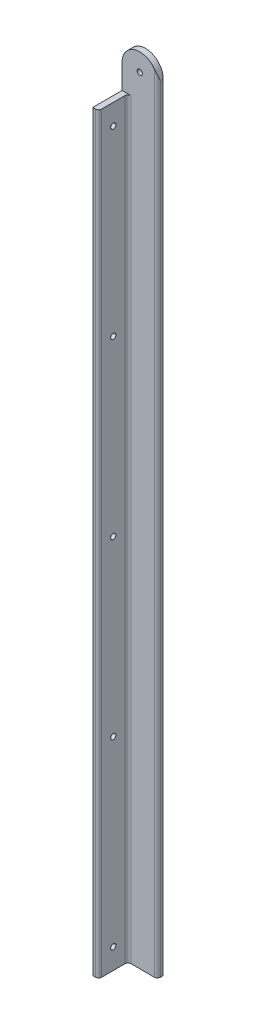
ISO-10303-21;
HEADER;
FILE_DESCRIPTION(('STEP AP214'),'2;1');
FILE_NAME('part.step','',(''),(''),'','','');
FILE_SCHEMA(('AUTOMOTIVE_DESIGN { 1 0 10303 214 1 1 1 1 }'));
ENDSEC;
DATA;
#1=APPLICATION_CONTEXT('core data for automotive mechanical design processes');
#2=APPLICATION_PROTOCOL_DEFINITION('international standard','automotive_design',2000,#1);
#3=PRODUCT_CONTEXT('',#1,'mechanical');
#4=PRODUCT('Part','Part','',(#3));
#5=PRODUCT_RELATED_PRODUCT_CATEGORY('part','',(#4));
#6=PRODUCT_DEFINITION_FORMATION('','',#4);
#7=PRODUCT_DEFINITION_CONTEXT('part definition',#1,'design');
#8=PRODUCT_DEFINITION('design','',#6,#7);
#9=PRODUCT_DEFINITION_SHAPE('','',#8);
#10=(LENGTH_UNIT() NAMED_UNIT(*) SI_UNIT(.MILLI.,.METRE.));
#11=(NAMED_UNIT(*) PLANE_ANGLE_UNIT() SI_UNIT($,.RADIAN.));
#12=(NAMED_UNIT(*) SI_UNIT($,.STERADIAN.) SOLID_ANGLE_UNIT());
#13=UNCERTAINTY_MEASURE_WITH_UNIT(LENGTH_MEASURE(1.E-05),#10,'distance_accuracy_value','');
#14=(GEOMETRIC_REPRESENTATION_CONTEXT(3) GLOBAL_UNCERTAINTY_ASSIGNED_CONTEXT((#13)) GLOBAL_UNIT_ASSIGNED_CONTEXT((#10,
#11,#12)) REPRESENTATION_CONTEXT('',''));
#15=CARTESIAN_POINT('',(0.,0.,0.));
#16=DIRECTION('',(0.,0.,1.));
#17=DIRECTION('',(1.,0.,0.));
#18=AXIS2_PLACEMENT_3D('',#15,#16,#17);
#19=CARTESIAN_POINT('',(0.,431.8,5.08));
#20=DIRECTION('',(0.,0.,1.));
#21=DIRECTION('',(-1.,0.,0.));
#22=AXIS2_PLACEMENT_3D('',#19,#20,#21);
#23=PLANE('',#22);
#24=CARTESIAN_POINT('',(9.525,419.735,5.08));
#25=DIRECTION('',(0.,0.,-1.));
#26=DIRECTION('',(-1.,0.,0.));
#27=AXIS2_PLACEMENT_3D('',#24,#25,#26);
#28=CIRCLE('',#27,1.42239999999997);
#29=CARTESIAN_POINT('',(8.10260000000003,419.735,5.08));
#30=VERTEX_POINT('',#29);
#31=EDGE_CURVE('E235',#30,#30,#28,.T.);
#32=ORIENTED_EDGE('',*,*,#31,.F.);
#33=EDGE_LOOP('',(#32));
#34=FACE_BOUND('',#33,.T.);
#35=DIRECTION('',(0.,-1.,0.));
#36=VECTOR('',#35,1.);
#37=CARTESIAN_POINT('',(0.,431.8,5.08));
#38=LINE('',#37,#36);
#39=CARTESIAN_POINT('',(0.,419.735,5.08));
#40=VERTEX_POINT('',#39);
#41=CARTESIAN_POINT('',(0.,0.,5.08));
#42=VERTEX_POINT('',#41);
#43=EDGE_CURVE('E11',#40,#42,#38,.T.);
#44=ORIENTED_EDGE('',*,*,#43,.F.);
#45=CARTESIAN_POINT('',(9.525,419.735,5.08));
#46=DIRECTION('',(0.,0.,1.));
#47=DIRECTION('',(1.,0.,0.));
#48=AXIS2_PLACEMENT_3D('',#45,#46,#47);
#49=CIRCLE('',#48,9.525);
#50=CARTESIAN_POINT('',(19.05,419.735,5.08));
#51=VERTEX_POINT('',#50);
#52=EDGE_CURVE('E125',#51,#40,#49,.T.);
#53=ORIENTED_EDGE('',*,*,#52,.F.);
#54=DIRECTION('',(0.,-1.,0.));
#55=VECTOR('',#54,1.);
#56=CARTESIAN_POINT('',(19.05,431.8,5.08));
#57=LINE('',#56,#55);
#58=CARTESIAN_POINT('',(19.05,0.,5.08));
#59=VERTEX_POINT('',#58);
#60=EDGE_CURVE('E42',#51,#59,#57,.T.);
#61=ORIENTED_EDGE('',*,*,#60,.T.);
#62=DIRECTION('',(1.,0.,0.));
#63=VECTOR('',#62,1.);
#64=CARTESIAN_POINT('',(0.,0.,5.08));
#65=LINE('',#64,#63);
#66=EDGE_CURVE('E144',#42,#59,#65,.T.);
#67=ORIENTED_EDGE('',*,*,#66,.F.);
#68=EDGE_LOOP('',(#44,#53,#61,#67));
#69=FACE_BOUND('',#68,.T.);
#70=ADVANCED_FACE('F34',(#34,#69),#23,.F.);
#71=CARTESIAN_POINT('',(4.76250000000001,431.8,8.255));
#72=DIRECTION('',(0.,0.,-1.));
#73=DIRECTION('',(1.,0.,0.));
#74=AXIS2_PLACEMENT_3D('',#71,#72,#73);
#75=PLANE('',#74);
#76=CARTESIAN_POINT('',(9.525,419.735,8.255));
#77=DIRECTION('',(0.,0.,-1.));
#78=DIRECTION('',(-1.,0.,0.));
#79=AXIS2_PLACEMENT_3D('',#76,#77,#78);
#80=CIRCLE('',#79,1.42239999999997);
#81=CARTESIAN_POINT('',(8.10260000000003,419.735,8.255));
#82=VERTEX_POINT('',#81);
#83=EDGE_CURVE('E240',#82,#82,#80,.T.);
#84=ORIENTED_EDGE('',*,*,#83,.T.);
#85=EDGE_LOOP('',(#84));
#86=FACE_BOUND('',#85,.T.);
#87=CARTESIAN_POINT('',(9.525,419.735,8.255));
#88=DIRECTION('',(0.,0.,1.));
#89=DIRECTION('',(1.,0.,0.));
#90=AXIS2_PLACEMENT_3D('',#87,#88,#89);
#91=CIRCLE('',#90,9.525);
#92=CARTESIAN_POINT('',(17.4625,425.000141854689,8.255));
#93=VERTEX_POINT('',#92);
#94=CARTESIAN_POINT('',(0.,419.735,8.255));
#95=VERTEX_POINT('',#94);
#96=EDGE_CURVE('E108',#93,#95,#91,.T.);
#97=ORIENTED_EDGE('',*,*,#96,.T.);
#98=DIRECTION('',(0.,-1.,0.));
#99=VECTOR('',#98,1.);
#100=CARTESIAN_POINT('',(0.,431.8,8.255));
#101=LINE('',#100,#99);
#102=CARTESIAN_POINT('',(0.,406.4,8.255));
#103=VERTEX_POINT('',#102);
#104=EDGE_CURVE('E113',#95,#103,#101,.T.);
#105=ORIENTED_EDGE('',*,*,#104,.T.);
#106=DIRECTION('',(1.,0.,0.));
#107=VECTOR('',#106,1.);
#108=CARTESIAN_POINT('',(-3.175,406.4,8.255));
#109=LINE('',#108,#107);
#110=CARTESIAN_POINT('',(4.7625,406.4,8.255));
#111=VERTEX_POINT('',#110);
#112=EDGE_CURVE('E137',#103,#111,#109,.T.);
#113=ORIENTED_EDGE('',*,*,#112,.T.);
#114=DIRECTION('',(0.,-1.,0.));
#115=VECTOR('',#114,1.);
#116=CARTESIAN_POINT('',(4.76250000000001,431.8,8.255));
#117=LINE('',#116,#115);
#118=CARTESIAN_POINT('',(4.76250000000001,0.,8.255));
#119=VERTEX_POINT('',#118);
#120=EDGE_CURVE('E176',#111,#119,#117,.T.);
#121=ORIENTED_EDGE('',*,*,#120,.T.);
#122=DIRECTION('',(-1.,0.,0.));
#123=VECTOR('',#122,1.);
#124=CARTESIAN_POINT('',(4.76250000000001,0.,8.255));
#125=LINE('',#124,#123);
#126=CARTESIAN_POINT('',(17.4625,0.,8.255));
#127=VERTEX_POINT('',#126);
#128=EDGE_CURVE('E153',#127,#119,#125,.T.);
#129=ORIENTED_EDGE('',*,*,#128,.F.);
#130=DIRECTION('',(0.,-1.,0.));
#131=VECTOR('',#130,1.);
#132=CARTESIAN_POINT('',(17.4625,431.8,8.255));
#133=LINE('',#132,#131);
#134=EDGE_CURVE('E116',#93,#127,#133,.T.);
#135=ORIENTED_EDGE('',*,*,#134,.F.);
#136=EDGE_LOOP('',(#97,#105,#113,#121,#129,#135));
#137=FACE_BOUND('',#136,.T.);
#138=ADVANCED_FACE('F110',(#86,#137),#75,.F.);
#139=CARTESIAN_POINT('',(0.,431.8,5.08));
#140=DIRECTION('',(1.,0.,0.));
#141=DIRECTION('',(0.,0.,1.));
#142=AXIS2_PLACEMENT_3D('',#139,#140,#141);
#143=PLANE('',#142);
#144=CARTESIAN_POINT('',(0.,203.2,16.1925));
#145=DIRECTION('',(-1.,0.,0.));
#146=DIRECTION('',(0.,0.,1.));
#147=AXIS2_PLACEMENT_3D('',#144,#145,#146);
#148=CIRCLE('',#147,1.4224);
#149=CARTESIAN_POINT('',(0.,203.2,17.6149));
#150=VERTEX_POINT('',#149);
#151=EDGE_CURVE('E205',#150,#150,#148,.T.);
#152=ORIENTED_EDGE('',*,*,#151,.F.);
#153=EDGE_LOOP('',(#152));
#154=FACE_BOUND('',#153,.T.);
#155=CARTESIAN_POINT('',(0.,296.8625,16.1925));
#156=DIRECTION('',(-1.,0.,0.));
#157=DIRECTION('',(0.,0.,1.));
#158=AXIS2_PLACEMENT_3D('',#155,#156,#157);
#159=CIRCLE('',#158,1.42239999999999);
#160=CARTESIAN_POINT('',(0.,296.8625,17.6149));
#161=VERTEX_POINT('',#160);
#162=EDGE_CURVE('E210',#161,#161,#159,.T.);
#163=ORIENTED_EDGE('',*,*,#162,.F.);
#164=EDGE_LOOP('',(#163));
#165=FACE_BOUND('',#164,.T.);
#166=CARTESIAN_POINT('',(0.,11.1125,16.1925));
#167=DIRECTION('',(-1.,0.,0.));
#168=DIRECTION('',(0.,0.,1.));
#169=AXIS2_PLACEMENT_3D('',#166,#167,#168);
#170=CIRCLE('',#169,1.4224);
#171=CARTESIAN_POINT('',(0.,11.1125,17.6149));
#172=VERTEX_POINT('',#171);
#173=EDGE_CURVE('E213',#172,#172,#170,.T.);
#174=ORIENTED_EDGE('',*,*,#173,.F.);
#175=EDGE_LOOP('',(#174));
#176=FACE_BOUND('',#175,.T.);
#177=CARTESIAN_POINT('',(0.,395.2875,16.1925));
#178=DIRECTION('',(-1.,0.,0.));
#179=DIRECTION('',(0.,0.,1.));
#180=AXIS2_PLACEMENT_3D('',#177,#178,#179);
#181=CIRCLE('',#180,1.42239999999999);
#182=CARTESIAN_POINT('',(0.,395.2875,17.6149));
#183=VERTEX_POINT('',#182);
#184=EDGE_CURVE('E216',#183,#183,#181,.T.);
#185=ORIENTED_EDGE('',*,*,#184,.F.);
#186=EDGE_LOOP('',(#185));
#187=FACE_BOUND('',#186,.T.);
#188=CARTESIAN_POINT('',(0.,109.5375,16.1925));
#189=DIRECTION('',(-1.,0.,0.));
#190=DIRECTION('',(0.,0.,1.));
#191=AXIS2_PLACEMENT_3D('',#188,#189,#190);
#192=CIRCLE('',#191,1.4224);
#193=CARTESIAN_POINT('',(0.,109.5375,17.6149));
#194=VERTEX_POINT('',#193);
#195=EDGE_CURVE('E219',#194,#194,#192,.T.);
#196=ORIENTED_EDGE('',*,*,#195,.F.);
#197=EDGE_LOOP('',(#196));
#198=FACE_BOUND('',#197,.T.);
#199=DIRECTION('',(0.,0.,1.));
#200=VECTOR('',#199,1.);
#201=CARTESIAN_POINT('',(0.,419.735,3.175));
#202=LINE('',#201,#200);
#203=EDGE_CURVE('E120',#40,#95,#202,.T.);
#204=ORIENTED_EDGE('',*,*,#203,.F.);
#205=ORIENTED_EDGE('',*,*,#43,.T.);
#206=DIRECTION('',(0.,0.,-1.));
#207=VECTOR('',#206,1.);
#208=CARTESIAN_POINT('',(0.,0.,5.08));
#209=LINE('',#208,#207);
#210=CARTESIAN_POINT('',(0.,0.,24.13));
#211=VERTEX_POINT('',#210);
#212=EDGE_CURVE('E142',#211,#42,#209,.T.);
#213=ORIENTED_EDGE('',*,*,#212,.F.);
#214=DIRECTION('',(0.,-1.,0.));
#215=VECTOR('',#214,1.);
#216=CARTESIAN_POINT('',(0.,431.8,24.13));
#217=LINE('',#216,#215);
#218=CARTESIAN_POINT('',(0.,406.4,24.13));
#219=VERTEX_POINT('',#218);
#220=EDGE_CURVE('E165',#219,#211,#217,.T.);
#221=ORIENTED_EDGE('',*,*,#220,.F.);
#222=DIRECTION('',(0.,0.,1.));
#223=VECTOR('',#222,1.);
#224=CARTESIAN_POINT('',(0.,406.4,5.08));
#225=LINE('',#224,#223);
#226=EDGE_CURVE('E132',#103,#219,#225,.T.);
#227=ORIENTED_EDGE('',*,*,#226,.F.);
#228=ORIENTED_EDGE('',*,*,#104,.F.);
#229=EDGE_LOOP('',(#204,#205,#213,#221,#227,#228));
#230=FACE_BOUND('',#229,.T.);
#231=ADVANCED_FACE('F36',(#154,#165,#176,#187,#198,#230),#143,.F.);
#232=CARTESIAN_POINT('',(17.4625,431.8,6.6675));
#233=DIRECTION('',(0.,-1.,0.));
#234=DIRECTION('',(0.,0.,1.));
#235=AXIS2_PLACEMENT_3D('',#232,#233,#234);
#236=CYLINDRICAL_SURFACE('',#235,1.5875);
#237=CARTESIAN_POINT('',(17.4625,425.000141854689,8.255));
#238=CARTESIAN_POINT('',(17.4997392791749,424.944002925377,8.25499615214643));
#239=CARTESIAN_POINT('',(17.536373915237,424.887479640377,8.25369016838648));
#240=CARTESIAN_POINT('',(17.6083819359371,424.773758463647,8.24869556195951));
#241=CARTESIAN_POINT('',(17.6437556487292,424.716560752668,8.24500756405749));
#242=CARTESIAN_POINT('',(17.7478202530281,424.544244775112,8.23071764843062));
#243=CARTESIAN_POINT('',(17.8145793164402,424.428215549899,8.21688830561011));
#244=CARTESIAN_POINT('',(17.9423765063516,424.194932953775,8.18217348122479));
#245=CARTESIAN_POINT('',(18.0034429518286,424.077689268159,8.16132560366118));
#246=CARTESIAN_POINT('',(18.1202351656761,423.841690327476,8.11370769118595));
#247=CARTESIAN_POINT('',(18.1759578480752,423.722934243319,8.08693426349494));
#248=CARTESIAN_POINT('',(18.3248482842563,423.387939847566,8.00485081909495));
#249=CARTESIAN_POINT('',(18.411955398212,423.170354267502,7.94394499984032));
#250=CARTESIAN_POINT('',(18.5690205190257,422.732576846335,7.81047394370353));
#251=CARTESIAN_POINT('',(18.6389690874301,422.512383640339,7.73790232594655));
#252=CARTESIAN_POINT('',(18.7623458871509,422.069537644883,7.58417825405285));
#253=CARTESIAN_POINT('',(18.8157189940662,421.846879145872,7.50299834715626));
#254=CARTESIAN_POINT('',(18.9060195544997,421.400511432413,7.33495823727454));
#255=CARTESIAN_POINT('',(18.9429538877723,421.176802697183,7.24810042802326));
#256=CARTESIAN_POINT('',(18.9975844367055,420.753006391992,7.08050701964616));
#257=CARTESIAN_POINT('',(19.0169317294611,420.552986247123,7.00012802102113));
#258=CARTESIAN_POINT('',(19.0429307652079,420.152986274274,6.8381235696164));
#259=CARTESIAN_POINT('',(19.0496035846517,419.953006933271,6.75650041405228));
#260=CARTESIAN_POINT('',(19.049994284112,419.747047487413,6.67241836542595));
#261=CARTESIAN_POINT('',(19.049999998203,419.741023721279,6.66995917315949));
#262=CARTESIAN_POINT('',(19.05,419.735,6.6675));
#263=B_SPLINE_CURVE_WITH_KNOTS('',3,(#237,#238,#239,#240,#241,#242,#243,#244,#245,#246,#247,
#248,#249,#250,#251,#252,#253,#254,#255,#256,#257,#258,#259,#260,#261,#262),.UNSPECIFIED.,.F.,
.F.,(4,2,2,2,2,2,2,2,2,2,2,2,4),(0.,0.202062368680547,0.404071761075862,0.807415380587611,
1.20863147119831,1.61007788229034,2.3354110075169,3.06114222873147,3.78926176219869,
4.5170762847979,5.16601746977773,5.81387857883188,5.83339780765582),.UNSPECIFIED.);
#264=CARTESIAN_POINT('',(19.05,419.735,6.6675));
#265=VERTEX_POINT('',#264);
#266=EDGE_CURVE('E244',#93,#265,#263,.T.);
#267=ORIENTED_EDGE('',*,*,#266,.F.);
#268=ORIENTED_EDGE('',*,*,#134,.T.);
#269=CARTESIAN_POINT('',(17.4625,0.,6.6675));
#270=DIRECTION('',(0.,-1.,0.));
#271=DIRECTION('',(0.,0.,1.));
#272=AXIS2_PLACEMENT_3D('',#269,#270,#271);
#273=CIRCLE('',#272,1.5875);
#274=CARTESIAN_POINT('',(19.05,0.,6.66749999999999));
#275=VERTEX_POINT('',#274);
#276=EDGE_CURVE('E150',#275,#127,#273,.T.);
#277=ORIENTED_EDGE('',*,*,#276,.F.);
#278=DIRECTION('',(0.,-1.,0.));
#279=VECTOR('',#278,1.);
#280=CARTESIAN_POINT('',(19.05,431.8,6.66749999999999));
#281=LINE('',#280,#279);
#282=EDGE_CURVE('E180',#265,#275,#281,.T.);
#283=ORIENTED_EDGE('',*,*,#282,.F.);
#284=EDGE_LOOP('',(#267,#268,#277,#283));
#285=FACE_BOUND('',#284,.T.);
#286=ADVANCED_FACE('F252',(#285),#236,.T.);
#287=CARTESIAN_POINT('',(19.05,431.8,6.66749999999999));
#288=DIRECTION('',(-1.,0.,0.));
#289=DIRECTION('',(0.,0.,-1.));
#290=AXIS2_PLACEMENT_3D('',#287,#288,#289);
#291=PLANE('',#290);
#292=ORIENTED_EDGE('',*,*,#60,.F.);
#293=DIRECTION('',(0.,0.,1.));
#294=VECTOR('',#293,1.);
#295=CARTESIAN_POINT('',(19.05,419.735,3.175));
#296=LINE('',#295,#294);
#297=EDGE_CURVE('E119',#51,#265,#296,.T.);
#298=ORIENTED_EDGE('',*,*,#297,.T.);
#299=ORIENTED_EDGE('',*,*,#282,.T.);
#300=DIRECTION('',(0.,0.,1.));
#301=VECTOR('',#300,1.);
#302=CARTESIAN_POINT('',(19.05,0.,6.66749999999999));
#303=LINE('',#302,#301);
#304=EDGE_CURVE('E147',#59,#275,#303,.T.);
#305=ORIENTED_EDGE('',*,*,#304,.F.);
#306=EDGE_LOOP('',(#292,#298,#299,#305));
#307=FACE_BOUND('',#306,.T.);
#308=ADVANCED_FACE('F187',(#307),#291,.F.);
#309=CARTESIAN_POINT('',(4.7625,431.8,9.8425));
#310=DIRECTION('',(0.,-1.,0.));
#311=DIRECTION('',(0.,0.,1.));
#312=AXIS2_PLACEMENT_3D('',#309,#310,#311);
#313=CYLINDRICAL_SURFACE('',#312,1.5875);
#314=DIRECTION('',(0.,-1.,0.));
#315=VECTOR('',#314,1.);
#316=CARTESIAN_POINT('',(3.175,431.8,9.84250000000001));
#317=LINE('',#316,#315);
#318=CARTESIAN_POINT('',(3.175,406.4,9.84250000000001));
#319=VERTEX_POINT('',#318);
#320=CARTESIAN_POINT('',(3.175,0.,9.84250000000001));
#321=VERTEX_POINT('',#320);
#322=EDGE_CURVE('E173',#319,#321,#317,.T.);
#323=ORIENTED_EDGE('',*,*,#322,.T.);
#324=CARTESIAN_POINT('',(4.7625,0.,9.8425));
#325=DIRECTION('',(0.,1.,0.));
#326=DIRECTION('',(0.,0.,-1.));
#327=AXIS2_PLACEMENT_3D('',#324,#325,#326);
#328=CIRCLE('',#327,1.5875);
#329=EDGE_CURVE('E156',#119,#321,#328,.T.);
#330=ORIENTED_EDGE('',*,*,#329,.F.);
#331=ORIENTED_EDGE('',*,*,#120,.F.);
#332=CARTESIAN_POINT('',(4.7625,406.4,9.8425));
#333=DIRECTION('',(0.,1.,0.));
#334=DIRECTION('',(0.,0.,1.));
#335=AXIS2_PLACEMENT_3D('',#332,#333,#334);
#336=CIRCLE('',#335,1.5875);
#337=EDGE_CURVE('E197',#319,#111,#336,.F.);
#338=ORIENTED_EDGE('',*,*,#337,.F.);
#339=EDGE_LOOP('',(#323,#330,#331,#338));
#340=FACE_BOUND('',#339,.T.);
#341=ADVANCED_FACE('F296',(#340),#313,.F.);
#342=CARTESIAN_POINT('',(3.175,431.8,9.84250000000001));
#343=DIRECTION('',(-1.,0.,0.));
#344=DIRECTION('',(0.,0.,-1.));
#345=AXIS2_PLACEMENT_3D('',#342,#343,#344);
#346=PLANE('',#345);
#347=CARTESIAN_POINT('',(3.175,203.2,16.1925));
#348=DIRECTION('',(-1.,0.,0.));
#349=DIRECTION('',(0.,0.,1.));
#350=AXIS2_PLACEMENT_3D('',#347,#348,#349);
#351=CIRCLE('',#350,1.4224);
#352=CARTESIAN_POINT('',(3.175,203.2,17.6149));
#353=VERTEX_POINT('',#352);
#354=EDGE_CURVE('E225',#353,#353,#351,.T.);
#355=ORIENTED_EDGE('',*,*,#354,.T.);
#356=EDGE_LOOP('',(#355));
#357=FACE_BOUND('',#356,.T.);
#358=CARTESIAN_POINT('',(3.175,296.8625,16.1925));
#359=DIRECTION('',(-1.,0.,0.));
#360=DIRECTION('',(0.,0.,1.));
#361=AXIS2_PLACEMENT_3D('',#358,#359,#360);
#362=CIRCLE('',#361,1.42239999999999);
#363=CARTESIAN_POINT('',(3.175,296.8625,17.6149));
#364=VERTEX_POINT('',#363);
#365=EDGE_CURVE('E226',#364,#364,#362,.T.);
#366=ORIENTED_EDGE('',*,*,#365,.T.);
#367=EDGE_LOOP('',(#366));
#368=FACE_BOUND('',#367,.T.);
#369=CARTESIAN_POINT('',(3.175,11.1125,16.1925));
#370=DIRECTION('',(-1.,0.,0.));
#371=DIRECTION('',(0.,0.,1.));
#372=AXIS2_PLACEMENT_3D('',#369,#370,#371);
#373=CIRCLE('',#372,1.4224);
#374=CARTESIAN_POINT('',(3.175,11.1125,17.6149));
#375=VERTEX_POINT('',#374);
#376=EDGE_CURVE('E229',#375,#375,#373,.T.);
#377=ORIENTED_EDGE('',*,*,#376,.T.);
#378=EDGE_LOOP('',(#377));
#379=FACE_BOUND('',#378,.T.);
#380=CARTESIAN_POINT('',(3.175,395.2875,16.1925));
#381=DIRECTION('',(-1.,0.,0.));
#382=DIRECTION('',(0.,0.,1.));
#383=AXIS2_PLACEMENT_3D('',#380,#381,#382);
#384=CIRCLE('',#383,1.42239999999999);
#385=CARTESIAN_POINT('',(3.175,395.2875,17.6149));
#386=VERTEX_POINT('',#385);
#387=EDGE_CURVE('E232',#386,#386,#384,.T.);
#388=ORIENTED_EDGE('',*,*,#387,.T.);
#389=EDGE_LOOP('',(#388));
#390=FACE_BOUND('',#389,.T.);
#391=CARTESIAN_POINT('',(3.175,109.5375,16.1925));
#392=DIRECTION('',(-1.,0.,0.));
#393=DIRECTION('',(0.,0.,1.));
#394=AXIS2_PLACEMENT_3D('',#391,#392,#393);
#395=CIRCLE('',#394,1.4224);
#396=CARTESIAN_POINT('',(3.175,109.5375,17.6149));
#397=VERTEX_POINT('',#396);
#398=EDGE_CURVE('E222',#397,#397,#395,.T.);
#399=ORIENTED_EDGE('',*,*,#398,.T.);
#400=EDGE_LOOP('',(#399));
#401=FACE_BOUND('',#400,.T.);
#402=DIRECTION('',(0.,-1.,0.));
#403=VECTOR('',#402,1.);
#404=CARTESIAN_POINT('',(3.175,431.8,22.5425));
#405=LINE('',#404,#403);
#406=CARTESIAN_POINT('',(3.175,406.4,22.5425));
#407=VERTEX_POINT('',#406);
#408=CARTESIAN_POINT('',(3.175,0.,22.5425));
#409=VERTEX_POINT('',#408);
#410=EDGE_CURVE('E170',#407,#409,#405,.T.);
#411=ORIENTED_EDGE('',*,*,#410,.T.);
#412=DIRECTION('',(0.,0.,1.));
#413=VECTOR('',#412,1.);
#414=CARTESIAN_POINT('',(3.175,0.,9.84250000000001));
#415=LINE('',#414,#413);
#416=EDGE_CURVE('E159',#321,#409,#415,.T.);
#417=ORIENTED_EDGE('',*,*,#416,.F.);
#418=ORIENTED_EDGE('',*,*,#322,.F.);
#419=DIRECTION('',(0.,0.,1.));
#420=VECTOR('',#419,1.);
#421=CARTESIAN_POINT('',(3.175,406.4,24.13));
#422=LINE('',#421,#420);
#423=EDGE_CURVE('E199',#319,#407,#422,.T.);
#424=ORIENTED_EDGE('',*,*,#423,.T.);
#425=EDGE_LOOP('',(#411,#417,#418,#424));
#426=FACE_BOUND('',#425,.T.);
#427=ADVANCED_FACE('F292',(#357,#368,#379,#390,#401,#426),#346,.F.);
#428=CARTESIAN_POINT('',(1.5875,431.8,22.5425));
#429=DIRECTION('',(0.,-1.,0.));
#430=DIRECTION('',(0.,0.,1.));
#431=AXIS2_PLACEMENT_3D('',#428,#429,#430);
#432=CYLINDRICAL_SURFACE('',#431,1.5875);
#433=DIRECTION('',(0.,-1.,0.));
#434=VECTOR('',#433,1.);
#435=CARTESIAN_POINT('',(1.58749999999999,431.8,24.13));
#436=LINE('',#435,#434);
#437=CARTESIAN_POINT('',(1.58749999999999,406.4,24.13));
#438=VERTEX_POINT('',#437);
#439=CARTESIAN_POINT('',(1.58749999999999,0.,24.13));
#440=VERTEX_POINT('',#439);
#441=EDGE_CURVE('E167',#438,#440,#436,.T.);
#442=ORIENTED_EDGE('',*,*,#441,.T.);
#443=CARTESIAN_POINT('',(1.5875,0.,22.5425));
#444=DIRECTION('',(0.,-1.,0.));
#445=DIRECTION('',(0.,0.,-1.));
#446=AXIS2_PLACEMENT_3D('',#443,#444,#445);
#447=CIRCLE('',#446,1.5875);
#448=EDGE_CURVE('E162',#409,#440,#447,.T.);
#449=ORIENTED_EDGE('',*,*,#448,.F.);
#450=ORIENTED_EDGE('',*,*,#410,.F.);
#451=CARTESIAN_POINT('',(1.5875,406.4,22.5425));
#452=DIRECTION('',(0.,1.,0.));
#453=DIRECTION('',(0.,0.,1.));
#454=AXIS2_PLACEMENT_3D('',#451,#452,#453);
#455=CIRCLE('',#454,1.5875);
#456=EDGE_CURVE('E133',#438,#407,#455,.T.);
#457=ORIENTED_EDGE('',*,*,#456,.F.);
#458=EDGE_LOOP('',(#442,#449,#450,#457));
#459=FACE_BOUND('',#458,.T.);
#460=ADVANCED_FACE('F289',(#459),#432,.T.);
#461=CARTESIAN_POINT('',(0.,431.8,24.13));
#462=DIRECTION('',(0.,0.,-1.));
#463=DIRECTION('',(1.,0.,0.));
#464=AXIS2_PLACEMENT_3D('',#461,#462,#463);
#465=PLANE('',#464);
#466=ORIENTED_EDGE('',*,*,#220,.T.);
#467=DIRECTION('',(-1.,0.,0.));
#468=VECTOR('',#467,1.);
#469=CARTESIAN_POINT('',(0.,0.,24.13));
#470=LINE('',#469,#468);
#471=EDGE_CURVE('E49',#440,#211,#470,.T.);
#472=ORIENTED_EDGE('',*,*,#471,.F.);
#473=ORIENTED_EDGE('',*,*,#441,.F.);
#474=DIRECTION('',(1.,0.,0.));
#475=VECTOR('',#474,1.);
#476=CARTESIAN_POINT('',(-3.175,406.4,24.13));
#477=LINE('',#476,#475);
#478=EDGE_CURVE('E134',#219,#438,#477,.T.);
#479=ORIENTED_EDGE('',*,*,#478,.F.);
#480=EDGE_LOOP('',(#466,#472,#473,#479));
#481=FACE_BOUND('',#480,.T.);
#482=ADVANCED_FACE('F192',(#481),#465,.F.);
#483=CARTESIAN_POINT('',(1.5875,0.,22.5425));
#484=DIRECTION('',(0.,1.,0.));
#485=DIRECTION('',(0.,0.,-1.));
#486=AXIS2_PLACEMENT_3D('',#483,#484,#485);
#487=PLANE('',#486);
#488=ORIENTED_EDGE('',*,*,#212,.T.);
#489=ORIENTED_EDGE('',*,*,#66,.T.);
#490=ORIENTED_EDGE('',*,*,#304,.T.);
#491=ORIENTED_EDGE('',*,*,#276,.T.);
#492=ORIENTED_EDGE('',*,*,#128,.T.);
#493=ORIENTED_EDGE('',*,*,#329,.T.);
#494=ORIENTED_EDGE('',*,*,#416,.T.);
#495=ORIENTED_EDGE('',*,*,#448,.T.);
#496=ORIENTED_EDGE('',*,*,#471,.T.);
#497=EDGE_LOOP('',(#488,#489,#490,#491,#492,#493,#494,#495,#496));
#498=FACE_BOUND('',#497,.T.);
#499=ADVANCED_FACE('F190',(#498),#487,.F.);
#500=CARTESIAN_POINT('',(-3.175,406.4,24.13));
#501=DIRECTION('',(0.,-1.,0.));
#502=DIRECTION('',(0.,0.,1.));
#503=AXIS2_PLACEMENT_3D('',#500,#501,#502);
#504=PLANE('',#503);
#505=ORIENTED_EDGE('',*,*,#112,.F.);
#506=ORIENTED_EDGE('',*,*,#226,.T.);
#507=ORIENTED_EDGE('',*,*,#478,.T.);
#508=ORIENTED_EDGE('',*,*,#456,.T.);
#509=ORIENTED_EDGE('',*,*,#423,.F.);
#510=ORIENTED_EDGE('',*,*,#337,.T.);
#511=EDGE_LOOP('',(#505,#506,#507,#508,#509,#510));
#512=FACE_BOUND('',#511,.T.);
#513=ADVANCED_FACE('F195',(#512),#504,.F.);
#514=CARTESIAN_POINT('',(-1.905,109.5375,16.1925));
#515=DIRECTION('',(1.,0.,0.));
#516=DIRECTION('',(0.,0.,1.));
#517=AXIS2_PLACEMENT_3D('',#514,#515,#516);
#518=CYLINDRICAL_SURFACE('',#517,1.4224);
#519=ORIENTED_EDGE('',*,*,#398,.F.);
#520=EDGE_LOOP('',(#519));
#521=FACE_BOUND('',#520,.T.);
#522=ORIENTED_EDGE('',*,*,#195,.T.);
#523=EDGE_LOOP('',(#522));
#524=FACE_BOUND('',#523,.T.);
#525=ADVANCED_FACE('F272',(#521,#524),#518,.F.);
#526=CARTESIAN_POINT('',(-1.905,395.2875,16.1925));
#527=DIRECTION('',(1.,0.,0.));
#528=DIRECTION('',(0.,0.,1.));
#529=AXIS2_PLACEMENT_3D('',#526,#527,#528);
#530=CYLINDRICAL_SURFACE('',#529,1.42239999999999);
#531=ORIENTED_EDGE('',*,*,#387,.F.);
#532=EDGE_LOOP('',(#531));
#533=FACE_BOUND('',#532,.T.);
#534=ORIENTED_EDGE('',*,*,#184,.T.);
#535=EDGE_LOOP('',(#534));
#536=FACE_BOUND('',#535,.T.);
#537=ADVANCED_FACE('F268',(#533,#536),#530,.F.);
#538=CARTESIAN_POINT('',(-1.905,11.1125,16.1925));
#539=DIRECTION('',(1.,0.,0.));
#540=DIRECTION('',(0.,0.,1.));
#541=AXIS2_PLACEMENT_3D('',#538,#539,#540);
#542=CYLINDRICAL_SURFACE('',#541,1.4224);
#543=ORIENTED_EDGE('',*,*,#376,.F.);
#544=EDGE_LOOP('',(#543));
#545=FACE_BOUND('',#544,.T.);
#546=ORIENTED_EDGE('',*,*,#173,.T.);
#547=EDGE_LOOP('',(#546));
#548=FACE_BOUND('',#547,.T.);
#549=ADVANCED_FACE('F264',(#545,#548),#542,.F.);
#550=CARTESIAN_POINT('',(-1.905,296.8625,16.1925));
#551=DIRECTION('',(1.,0.,0.));
#552=DIRECTION('',(0.,0.,1.));
#553=AXIS2_PLACEMENT_3D('',#550,#551,#552);
#554=CYLINDRICAL_SURFACE('',#553,1.42239999999999);
#555=ORIENTED_EDGE('',*,*,#365,.F.);
#556=EDGE_LOOP('',(#555));
#557=FACE_BOUND('',#556,.T.);
#558=ORIENTED_EDGE('',*,*,#162,.T.);
#559=EDGE_LOOP('',(#558));
#560=FACE_BOUND('',#559,.T.);
#561=ADVANCED_FACE('F267',(#557,#560),#554,.F.);
#562=CARTESIAN_POINT('',(-1.905,203.2,16.1925));
#563=DIRECTION('',(1.,0.,0.));
#564=DIRECTION('',(0.,0.,1.));
#565=AXIS2_PLACEMENT_3D('',#562,#563,#564);
#566=CYLINDRICAL_SURFACE('',#565,1.4224);
#567=ORIENTED_EDGE('',*,*,#354,.F.);
#568=EDGE_LOOP('',(#567));
#569=FACE_BOUND('',#568,.T.);
#570=ORIENTED_EDGE('',*,*,#151,.T.);
#571=EDGE_LOOP('',(#570));
#572=FACE_BOUND('',#571,.T.);
#573=ADVANCED_FACE('F262',(#569,#572),#566,.F.);
#574=CARTESIAN_POINT('',(9.525,419.735,3.175));
#575=DIRECTION('',(0.,0.,1.));
#576=DIRECTION('',(-1.,0.,0.));
#577=AXIS2_PLACEMENT_3D('',#574,#575,#576);
#578=CYLINDRICAL_SURFACE('',#577,1.42239999999997);
#579=ORIENTED_EDGE('',*,*,#83,.F.);
#580=EDGE_LOOP('',(#579));
#581=FACE_BOUND('',#580,.T.);
#582=ORIENTED_EDGE('',*,*,#31,.T.);
#583=EDGE_LOOP('',(#582));
#584=FACE_BOUND('',#583,.T.);
#585=ADVANCED_FACE('F259',(#581,#584),#578,.F.);
#586=CARTESIAN_POINT('',(9.525,419.735,3.175));
#587=DIRECTION('',(0.,0.,1.));
#588=DIRECTION('',(1.,0.,0.));
#589=AXIS2_PLACEMENT_3D('',#586,#587,#588);
#590=CYLINDRICAL_SURFACE('',#589,9.525);
#591=ORIENTED_EDGE('',*,*,#52,.T.);
#592=ORIENTED_EDGE('',*,*,#203,.T.);
#593=ORIENTED_EDGE('',*,*,#96,.F.);
#594=ORIENTED_EDGE('',*,*,#266,.T.);
#595=ORIENTED_EDGE('',*,*,#297,.F.);
#596=EDGE_LOOP('',(#591,#592,#593,#594,#595));
#597=FACE_BOUND('',#596,.T.);
#598=ADVANCED_FACE('F123',(#597),#590,.T.);
#599=CLOSED_SHELL('',(#70,#138,#231,#286,#308,#341,#427,#460,#482,#499,#513,#525,#537,#549,#561,
#573,#585,#598));
#600=MANIFOLD_SOLID_BREP('B2',#599);
#601=ADVANCED_BREP_SHAPE_REPRESENTATION('',(#18,#600),#14);
#602=SHAPE_DEFINITION_REPRESENTATION(#9,#601);
ENDSEC;
END-ISO-10303-21;
